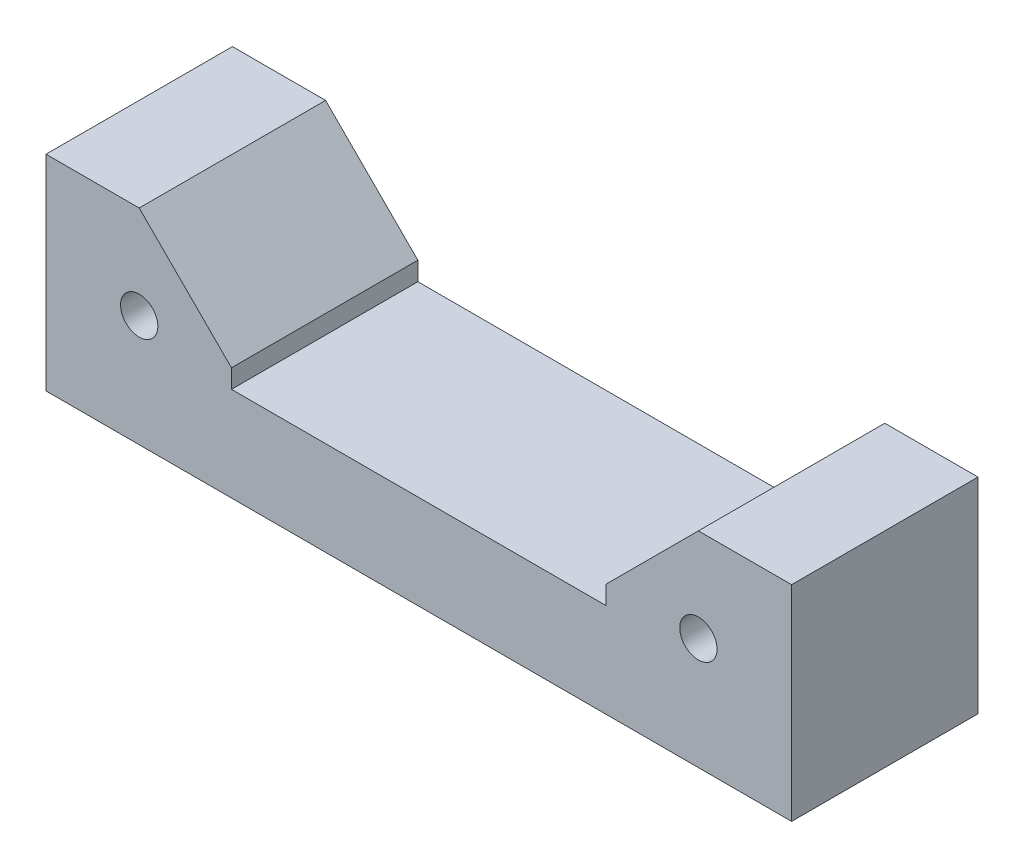
ISO-10303-21;
HEADER;
FILE_DESCRIPTION(('STEP AP214'),'2;1');
FILE_NAME('part.step','',(''),(''),'','','');
FILE_SCHEMA(('AUTOMOTIVE_DESIGN { 1 0 10303 214 1 1 1 1 }'));
ENDSEC;
DATA;
#1=APPLICATION_CONTEXT('core data for automotive mechanical design processes');
#2=APPLICATION_PROTOCOL_DEFINITION('international standard','automotive_design',2000,#1);
#3=PRODUCT_CONTEXT('',#1,'mechanical');
#4=PRODUCT('Part','Part','',(#3));
#5=PRODUCT_RELATED_PRODUCT_CATEGORY('part','',(#4));
#6=PRODUCT_DEFINITION_FORMATION('','',#4);
#7=PRODUCT_DEFINITION_CONTEXT('part definition',#1,'design');
#8=PRODUCT_DEFINITION('design','',#6,#7);
#9=PRODUCT_DEFINITION_SHAPE('','',#8);
#10=(LENGTH_UNIT() NAMED_UNIT(*) SI_UNIT(.MILLI.,.METRE.));
#11=(NAMED_UNIT(*) PLANE_ANGLE_UNIT() SI_UNIT($,.RADIAN.));
#12=(NAMED_UNIT(*) SI_UNIT($,.STERADIAN.) SOLID_ANGLE_UNIT());
#13=UNCERTAINTY_MEASURE_WITH_UNIT(LENGTH_MEASURE(1.E-05),#10,'distance_accuracy_value','');
#14=(GEOMETRIC_REPRESENTATION_CONTEXT(3) GLOBAL_UNCERTAINTY_ASSIGNED_CONTEXT((#13)) GLOBAL_UNIT_ASSIGNED_CONTEXT((#10,
#11,#12)) REPRESENTATION_CONTEXT('',''));
#15=CARTESIAN_POINT('',(0.,0.,0.));
#16=DIRECTION('',(0.,0.,1.));
#17=DIRECTION('',(1.,0.,0.));
#18=AXIS2_PLACEMENT_3D('',#15,#16,#17);
#19=CARTESIAN_POINT('',(0.,0.,5.));
#20=DIRECTION('',(0.,0.,-1.));
#21=DIRECTION('',(-1.,0.,0.));
#22=AXIS2_PLACEMENT_3D('',#19,#20,#21);
#23=PLANE('',#22);
#24=DIRECTION('',(0.,-1.,0.));
#25=VECTOR('',#24,1.);
#26=CARTESIAN_POINT('',(-20.,0.,5.));
#27=LINE('',#26,#25);
#28=CARTESIAN_POINT('',(-20.,11.,5.));
#29=VERTEX_POINT('',#28);
#30=CARTESIAN_POINT('',(-20.,0.,5.));
#31=VERTEX_POINT('',#30);
#32=EDGE_CURVE('E186',#29,#31,#27,.T.);
#33=ORIENTED_EDGE('',*,*,#32,.T.);
#34=DIRECTION('',(1.,0.,0.));
#35=VECTOR('',#34,1.);
#36=CARTESIAN_POINT('',(-20.,0.,5.));
#37=LINE('',#36,#35);
#38=CARTESIAN_POINT('',(20.,0.,5.));
#39=VERTEX_POINT('',#38);
#40=EDGE_CURVE('E110',#31,#39,#37,.T.);
#41=ORIENTED_EDGE('',*,*,#40,.T.);
#42=DIRECTION('',(0.,1.,0.));
#43=VECTOR('',#42,1.);
#44=CARTESIAN_POINT('',(20.,0.,5.));
#45=LINE('',#44,#43);
#46=CARTESIAN_POINT('',(20.,11.,5.));
#47=VERTEX_POINT('',#46);
#48=EDGE_CURVE('E215',#39,#47,#45,.T.);
#49=ORIENTED_EDGE('',*,*,#48,.T.);
#50=DIRECTION('',(-1.,0.,0.));
#51=VECTOR('',#50,1.);
#52=CARTESIAN_POINT('',(20.,11.,5.));
#53=LINE('',#52,#51);
#54=CARTESIAN_POINT('',(15.,11.,5.));
#55=VERTEX_POINT('',#54);
#56=EDGE_CURVE('E235',#47,#55,#53,.T.);
#57=ORIENTED_EDGE('',*,*,#56,.T.);
#58=DIRECTION('',(-0.707106781186549,-0.707106781186546,0.));
#59=VECTOR('',#58,1.);
#60=CARTESIAN_POINT('',(15.,11.,5.));
#61=LINE('',#60,#59);
#62=CARTESIAN_POINT('',(10.0502525316942,6.05025253169418,5.));
#63=VERTEX_POINT('',#62);
#64=EDGE_CURVE('E231',#55,#63,#61,.T.);
#65=ORIENTED_EDGE('',*,*,#64,.T.);
#66=DIRECTION('',(0.,-1.,0.));
#67=VECTOR('',#66,1.);
#68=CARTESIAN_POINT('',(10.0502525316942,6.05025253169418,5.));
#69=LINE('',#68,#67);
#70=CARTESIAN_POINT('',(10.0502525316942,5.05025253169418,5.));
#71=VERTEX_POINT('',#70);
#72=EDGE_CURVE('E234',#63,#71,#69,.T.);
#73=ORIENTED_EDGE('',*,*,#72,.T.);
#74=DIRECTION('',(-1.,0.,0.));
#75=VECTOR('',#74,1.);
#76=CARTESIAN_POINT('',(-10.0502525316942,5.05025253169418,5.));
#77=LINE('',#76,#75);
#78=CARTESIAN_POINT('',(-10.0502525316942,5.05025253169418,5.));
#79=VERTEX_POINT('',#78);
#80=EDGE_CURVE('E135',#71,#79,#77,.T.);
#81=ORIENTED_EDGE('',*,*,#80,.T.);
#82=DIRECTION('',(0.,1.,0.));
#83=VECTOR('',#82,1.);
#84=CARTESIAN_POINT('',(-10.0502525316942,6.05025253169418,5.));
#85=LINE('',#84,#83);
#86=CARTESIAN_POINT('',(-10.0502525316942,6.05025253169418,5.));
#87=VERTEX_POINT('',#86);
#88=EDGE_CURVE('E129',#79,#87,#85,.T.);
#89=ORIENTED_EDGE('',*,*,#88,.T.);
#90=DIRECTION('',(-0.707106781186549,0.707106781186546,0.));
#91=VECTOR('',#90,1.);
#92=CARTESIAN_POINT('',(-15.,11.,5.));
#93=LINE('',#92,#91);
#94=CARTESIAN_POINT('',(-15.,11.,5.));
#95=VERTEX_POINT('',#94);
#96=EDGE_CURVE('E133',#87,#95,#93,.T.);
#97=ORIENTED_EDGE('',*,*,#96,.T.);
#98=DIRECTION('',(-1.,0.,0.));
#99=VECTOR('',#98,1.);
#100=CARTESIAN_POINT('',(-20.,11.,5.));
#101=LINE('',#100,#99);
#102=EDGE_CURVE('E61',#95,#29,#101,.T.);
#103=ORIENTED_EDGE('',*,*,#102,.T.);
#104=EDGE_LOOP('',(#33,#41,#49,#57,#65,#73,#81,#89,#97,#103));
#105=FACE_BOUND('',#104,.T.);
#106=CARTESIAN_POINT('',(-15.,6.,5.));
#107=DIRECTION('',(0.,0.,1.));
#108=DIRECTION('',(1.,0.,0.));
#109=AXIS2_PLACEMENT_3D('',#106,#107,#108);
#110=CIRCLE('',#109,1.);
#111=CARTESIAN_POINT('',(-14.,6.,5.));
#112=VERTEX_POINT('',#111);
#113=EDGE_CURVE('E162',#112,#112,#110,.T.);
#114=ORIENTED_EDGE('',*,*,#113,.F.);
#115=EDGE_LOOP('',(#114));
#116=FACE_BOUND('',#115,.T.);
#117=CARTESIAN_POINT('',(15.,6.,5.));
#118=DIRECTION('',(0.,0.,1.));
#119=DIRECTION('',(-1.,0.,0.));
#120=AXIS2_PLACEMENT_3D('',#117,#118,#119);
#121=CIRCLE('',#120,1.);
#122=CARTESIAN_POINT('',(14.,6.,5.));
#123=VERTEX_POINT('',#122);
#124=EDGE_CURVE('E253',#123,#123,#121,.T.);
#125=ORIENTED_EDGE('',*,*,#124,.F.);
#126=EDGE_LOOP('',(#125));
#127=FACE_BOUND('',#126,.T.);
#128=ADVANCED_FACE('F43',(#105,#116,#127),#23,.F.);
#129=CARTESIAN_POINT('',(0.,0.,-5.));
#130=DIRECTION('',(0.,0.,-1.));
#131=DIRECTION('',(-1.,0.,0.));
#132=AXIS2_PLACEMENT_3D('',#129,#130,#131);
#133=PLANE('',#132);
#134=CARTESIAN_POINT('',(-15.,6.,-5.));
#135=DIRECTION('',(0.,0.,1.));
#136=DIRECTION('',(1.,0.,0.));
#137=AXIS2_PLACEMENT_3D('',#134,#135,#136);
#138=CIRCLE('',#137,1.);
#139=CARTESIAN_POINT('',(-14.,6.,-5.));
#140=VERTEX_POINT('',#139);
#141=EDGE_CURVE('E249',#140,#140,#138,.T.);
#142=ORIENTED_EDGE('',*,*,#141,.T.);
#143=EDGE_LOOP('',(#142));
#144=FACE_BOUND('',#143,.T.);
#145=DIRECTION('',(0.,-1.,0.));
#146=VECTOR('',#145,1.);
#147=CARTESIAN_POINT('',(-20.,0.,-5.));
#148=LINE('',#147,#146);
#149=CARTESIAN_POINT('',(-20.,11.,-5.));
#150=VERTEX_POINT('',#149);
#151=CARTESIAN_POINT('',(-20.,0.,-5.));
#152=VERTEX_POINT('',#151);
#153=EDGE_CURVE('E157',#150,#152,#148,.T.);
#154=ORIENTED_EDGE('',*,*,#153,.F.);
#155=DIRECTION('',(-1.,0.,0.));
#156=VECTOR('',#155,1.);
#157=CARTESIAN_POINT('',(-20.,11.,-5.));
#158=LINE('',#157,#156);
#159=CARTESIAN_POINT('',(-15.,11.,-5.));
#160=VERTEX_POINT('',#159);
#161=EDGE_CURVE('E102',#160,#150,#158,.T.);
#162=ORIENTED_EDGE('',*,*,#161,.F.);
#163=DIRECTION('',(-0.707106781186549,0.707106781186546,0.));
#164=VECTOR('',#163,1.);
#165=CARTESIAN_POINT('',(-15.,11.,-5.));
#166=LINE('',#165,#164);
#167=CARTESIAN_POINT('',(-10.0502525316942,6.05025253169418,-5.));
#168=VERTEX_POINT('',#167);
#169=EDGE_CURVE('E96',#168,#160,#166,.T.);
#170=ORIENTED_EDGE('',*,*,#169,.F.);
#171=DIRECTION('',(0.,1.,0.));
#172=VECTOR('',#171,1.);
#173=CARTESIAN_POINT('',(-10.0502525316942,6.05025253169418,-5.));
#174=LINE('',#173,#172);
#175=CARTESIAN_POINT('',(-10.0502525316942,5.05025253169418,-5.));
#176=VERTEX_POINT('',#175);
#177=EDGE_CURVE('E144',#176,#168,#174,.T.);
#178=ORIENTED_EDGE('',*,*,#177,.F.);
#179=DIRECTION('',(-1.,0.,0.));
#180=VECTOR('',#179,1.);
#181=CARTESIAN_POINT('',(-10.0502525316942,5.05025253169418,-5.));
#182=LINE('',#181,#180);
#183=CARTESIAN_POINT('',(10.0502525316942,5.05025253169418,-5.));
#184=VERTEX_POINT('',#183);
#185=EDGE_CURVE('E177',#184,#176,#182,.T.);
#186=ORIENTED_EDGE('',*,*,#185,.F.);
#187=DIRECTION('',(0.,-1.,0.));
#188=VECTOR('',#187,1.);
#189=CARTESIAN_POINT('',(10.0502525316942,6.05025253169418,-5.));
#190=LINE('',#189,#188);
#191=CARTESIAN_POINT('',(10.0502525316942,6.05025253169418,-5.));
#192=VERTEX_POINT('',#191);
#193=EDGE_CURVE('E174',#192,#184,#190,.T.);
#194=ORIENTED_EDGE('',*,*,#193,.F.);
#195=DIRECTION('',(-0.707106781186549,-0.707106781186546,0.));
#196=VECTOR('',#195,1.);
#197=CARTESIAN_POINT('',(15.,11.,-5.));
#198=LINE('',#197,#196);
#199=CARTESIAN_POINT('',(15.,11.,-5.));
#200=VERTEX_POINT('',#199);
#201=EDGE_CURVE('E171',#200,#192,#198,.T.);
#202=ORIENTED_EDGE('',*,*,#201,.F.);
#203=DIRECTION('',(-1.,0.,0.));
#204=VECTOR('',#203,1.);
#205=CARTESIAN_POINT('',(20.,11.,-5.));
#206=LINE('',#205,#204);
#207=CARTESIAN_POINT('',(20.,11.,-5.));
#208=VERTEX_POINT('',#207);
#209=EDGE_CURVE('E168',#208,#200,#206,.T.);
#210=ORIENTED_EDGE('',*,*,#209,.F.);
#211=DIRECTION('',(0.,1.,0.));
#212=VECTOR('',#211,1.);
#213=CARTESIAN_POINT('',(20.,0.,-5.));
#214=LINE('',#213,#212);
#215=CARTESIAN_POINT('',(20.,0.,-5.));
#216=VERTEX_POINT('',#215);
#217=EDGE_CURVE('E165',#216,#208,#214,.T.);
#218=ORIENTED_EDGE('',*,*,#217,.F.);
#219=DIRECTION('',(1.,0.,0.));
#220=VECTOR('',#219,1.);
#221=CARTESIAN_POINT('',(-20.,0.,-5.));
#222=LINE('',#221,#220);
#223=EDGE_CURVE('E161',#152,#216,#222,.T.);
#224=ORIENTED_EDGE('',*,*,#223,.F.);
#225=EDGE_LOOP('',(#154,#162,#170,#178,#186,#194,#202,#210,#218,#224));
#226=FACE_BOUND('',#225,.T.);
#227=CARTESIAN_POINT('',(15.,6.,-5.));
#228=DIRECTION('',(0.,0.,1.));
#229=DIRECTION('',(-1.,0.,0.));
#230=AXIS2_PLACEMENT_3D('',#227,#228,#229);
#231=CIRCLE('',#230,1.);
#232=CARTESIAN_POINT('',(14.,6.,-5.));
#233=VERTEX_POINT('',#232);
#234=EDGE_CURVE('E257',#233,#233,#231,.T.);
#235=ORIENTED_EDGE('',*,*,#234,.T.);
#236=EDGE_LOOP('',(#235));
#237=FACE_BOUND('',#236,.T.);
#238=ADVANCED_FACE('F219',(#144,#226,#237),#133,.T.);
#239=CARTESIAN_POINT('',(-20.,0.,5.));
#240=DIRECTION('',(1.,0.,0.));
#241=DIRECTION('',(0.,0.,-1.));
#242=AXIS2_PLACEMENT_3D('',#239,#240,#241);
#243=PLANE('',#242);
#244=ORIENTED_EDGE('',*,*,#153,.T.);
#245=DIRECTION('',(0.,0.,-1.));
#246=VECTOR('',#245,1.);
#247=CARTESIAN_POINT('',(-20.,0.,5.));
#248=LINE('',#247,#246);
#249=EDGE_CURVE('E11',#31,#152,#248,.T.);
#250=ORIENTED_EDGE('',*,*,#249,.F.);
#251=ORIENTED_EDGE('',*,*,#32,.F.);
#252=DIRECTION('',(0.,0.,-1.));
#253=VECTOR('',#252,1.);
#254=CARTESIAN_POINT('',(-20.,11.,5.));
#255=LINE('',#254,#253);
#256=EDGE_CURVE('E153',#29,#150,#255,.T.);
#257=ORIENTED_EDGE('',*,*,#256,.T.);
#258=EDGE_LOOP('',(#244,#250,#251,#257));
#259=FACE_BOUND('',#258,.T.);
#260=ADVANCED_FACE('F45',(#259),#243,.F.);
#261=CARTESIAN_POINT('',(-20.,0.,5.));
#262=DIRECTION('',(0.,1.,0.));
#263=DIRECTION('',(-1.,0.,0.));
#264=AXIS2_PLACEMENT_3D('',#261,#262,#263);
#265=PLANE('',#264);
#266=ORIENTED_EDGE('',*,*,#223,.T.);
#267=DIRECTION('',(0.,0.,-1.));
#268=VECTOR('',#267,1.);
#269=CARTESIAN_POINT('',(20.,0.,5.));
#270=LINE('',#269,#268);
#271=EDGE_CURVE('E53',#39,#216,#270,.T.);
#272=ORIENTED_EDGE('',*,*,#271,.F.);
#273=ORIENTED_EDGE('',*,*,#40,.F.);
#274=ORIENTED_EDGE('',*,*,#249,.T.);
#275=EDGE_LOOP('',(#266,#272,#273,#274));
#276=FACE_BOUND('',#275,.T.);
#277=ADVANCED_FACE('F299',(#276),#265,.F.);
#278=CARTESIAN_POINT('',(20.,0.,5.));
#279=DIRECTION('',(-1.,0.,0.));
#280=DIRECTION('',(0.,0.,1.));
#281=AXIS2_PLACEMENT_3D('',#278,#279,#280);
#282=PLANE('',#281);
#283=ORIENTED_EDGE('',*,*,#217,.T.);
#284=DIRECTION('',(0.,0.,-1.));
#285=VECTOR('',#284,1.);
#286=CARTESIAN_POINT('',(20.,11.,5.));
#287=LINE('',#286,#285);
#288=EDGE_CURVE('E205',#47,#208,#287,.T.);
#289=ORIENTED_EDGE('',*,*,#288,.F.);
#290=ORIENTED_EDGE('',*,*,#48,.F.);
#291=ORIENTED_EDGE('',*,*,#271,.T.);
#292=EDGE_LOOP('',(#283,#289,#290,#291));
#293=FACE_BOUND('',#292,.T.);
#294=ADVANCED_FACE('F213',(#293),#282,.F.);
#295=CARTESIAN_POINT('',(20.,11.,5.));
#296=DIRECTION('',(0.,-1.,0.));
#297=DIRECTION('',(0.,0.,-1.));
#298=AXIS2_PLACEMENT_3D('',#295,#296,#297);
#299=PLANE('',#298);
#300=ORIENTED_EDGE('',*,*,#209,.T.);
#301=DIRECTION('',(0.,0.,-1.));
#302=VECTOR('',#301,1.);
#303=CARTESIAN_POINT('',(15.,11.,5.));
#304=LINE('',#303,#302);
#305=EDGE_CURVE('E201',#55,#200,#304,.T.);
#306=ORIENTED_EDGE('',*,*,#305,.F.);
#307=ORIENTED_EDGE('',*,*,#56,.F.);
#308=ORIENTED_EDGE('',*,*,#288,.T.);
#309=EDGE_LOOP('',(#300,#306,#307,#308));
#310=FACE_BOUND('',#309,.T.);
#311=ADVANCED_FACE('F225',(#310),#299,.F.);
#312=CARTESIAN_POINT('',(15.,11.,5.));
#313=DIRECTION('',(0.707106781186546,-0.707106781186549,0.));
#314=DIRECTION('',(0.707106781186549,0.707106781186546,0.));
#315=AXIS2_PLACEMENT_3D('',#312,#313,#314);
#316=PLANE('',#315);
#317=ORIENTED_EDGE('',*,*,#201,.T.);
#318=DIRECTION('',(0.,0.,-1.));
#319=VECTOR('',#318,1.);
#320=CARTESIAN_POINT('',(10.0502525316942,6.05025253169418,5.));
#321=LINE('',#320,#319);
#322=EDGE_CURVE('E197',#63,#192,#321,.T.);
#323=ORIENTED_EDGE('',*,*,#322,.F.);
#324=ORIENTED_EDGE('',*,*,#64,.F.);
#325=ORIENTED_EDGE('',*,*,#305,.T.);
#326=EDGE_LOOP('',(#317,#323,#324,#325));
#327=FACE_BOUND('',#326,.T.);
#328=ADVANCED_FACE('F229',(#327),#316,.F.);
#329=CARTESIAN_POINT('',(10.0502525316942,6.05025253169418,5.));
#330=DIRECTION('',(1.,0.,0.));
#331=DIRECTION('',(0.,0.,-1.));
#332=AXIS2_PLACEMENT_3D('',#329,#330,#331);
#333=PLANE('',#332);
#334=ORIENTED_EDGE('',*,*,#193,.T.);
#335=DIRECTION('',(0.,0.,-1.));
#336=VECTOR('',#335,1.);
#337=CARTESIAN_POINT('',(10.0502525316942,5.05025253169418,5.));
#338=LINE('',#337,#336);
#339=EDGE_CURVE('E193',#71,#184,#338,.T.);
#340=ORIENTED_EDGE('',*,*,#339,.F.);
#341=ORIENTED_EDGE('',*,*,#72,.F.);
#342=ORIENTED_EDGE('',*,*,#322,.T.);
#343=EDGE_LOOP('',(#334,#340,#341,#342));
#344=FACE_BOUND('',#343,.T.);
#345=ADVANCED_FACE('F289',(#344),#333,.F.);
#346=CARTESIAN_POINT('',(-10.0502525316942,5.05025253169418,5.));
#347=DIRECTION('',(0.,-1.,0.));
#348=DIRECTION('',(1.,0.,0.));
#349=AXIS2_PLACEMENT_3D('',#346,#347,#348);
#350=PLANE('',#349);
#351=ORIENTED_EDGE('',*,*,#185,.T.);
#352=DIRECTION('',(0.,0.,-1.));
#353=VECTOR('',#352,1.);
#354=CARTESIAN_POINT('',(-10.0502525316942,5.05025253169418,5.));
#355=LINE('',#354,#353);
#356=EDGE_CURVE('E146',#79,#176,#355,.T.);
#357=ORIENTED_EDGE('',*,*,#356,.F.);
#358=ORIENTED_EDGE('',*,*,#80,.F.);
#359=ORIENTED_EDGE('',*,*,#339,.T.);
#360=EDGE_LOOP('',(#351,#357,#358,#359));
#361=FACE_BOUND('',#360,.T.);
#362=ADVANCED_FACE('F286',(#361),#350,.F.);
#363=CARTESIAN_POINT('',(-10.0502525316942,6.05025253169418,5.));
#364=DIRECTION('',(-1.,0.,0.));
#365=DIRECTION('',(0.,0.,1.));
#366=AXIS2_PLACEMENT_3D('',#363,#364,#365);
#367=PLANE('',#366);
#368=ORIENTED_EDGE('',*,*,#177,.T.);
#369=DIRECTION('',(0.,0.,-1.));
#370=VECTOR('',#369,1.);
#371=CARTESIAN_POINT('',(-10.0502525316942,6.05025253169418,5.));
#372=LINE('',#371,#370);
#373=EDGE_CURVE('E141',#87,#168,#372,.T.);
#374=ORIENTED_EDGE('',*,*,#373,.F.);
#375=ORIENTED_EDGE('',*,*,#88,.F.);
#376=ORIENTED_EDGE('',*,*,#356,.T.);
#377=EDGE_LOOP('',(#368,#374,#375,#376));
#378=FACE_BOUND('',#377,.T.);
#379=ADVANCED_FACE('F142',(#378),#367,.F.);
#380=CARTESIAN_POINT('',(-15.,11.,5.));
#381=DIRECTION('',(-0.707106781186546,-0.707106781186549,0.));
#382=DIRECTION('',(0.707106781186549,-0.707106781186546,0.));
#383=AXIS2_PLACEMENT_3D('',#380,#381,#382);
#384=PLANE('',#383);
#385=ORIENTED_EDGE('',*,*,#169,.T.);
#386=DIRECTION('',(0.,0.,-1.));
#387=VECTOR('',#386,1.);
#388=CARTESIAN_POINT('',(-15.,11.,5.));
#389=LINE('',#388,#387);
#390=EDGE_CURVE('E147',#95,#160,#389,.T.);
#391=ORIENTED_EDGE('',*,*,#390,.F.);
#392=ORIENTED_EDGE('',*,*,#96,.F.);
#393=ORIENTED_EDGE('',*,*,#373,.T.);
#394=EDGE_LOOP('',(#385,#391,#392,#393));
#395=FACE_BOUND('',#394,.T.);
#396=ADVANCED_FACE('F149',(#395),#384,.F.);
#397=CARTESIAN_POINT('',(-20.,11.,5.));
#398=DIRECTION('',(0.,-1.,0.));
#399=DIRECTION('',(0.,0.,-1.));
#400=AXIS2_PLACEMENT_3D('',#397,#398,#399);
#401=PLANE('',#400);
#402=ORIENTED_EDGE('',*,*,#161,.T.);
#403=ORIENTED_EDGE('',*,*,#256,.F.);
#404=ORIENTED_EDGE('',*,*,#102,.F.);
#405=ORIENTED_EDGE('',*,*,#390,.T.);
#406=EDGE_LOOP('',(#402,#403,#404,#405));
#407=FACE_BOUND('',#406,.T.);
#408=ADVANCED_FACE('F279',(#407),#401,.F.);
#409=CARTESIAN_POINT('',(-15.,6.,5.));
#410=DIRECTION('',(0.,0.,-1.));
#411=DIRECTION('',(-1.,0.,0.));
#412=AXIS2_PLACEMENT_3D('',#409,#410,#411);
#413=CYLINDRICAL_SURFACE('',#412,1.);
#414=ORIENTED_EDGE('',*,*,#113,.T.);
#415=EDGE_LOOP('',(#414));
#416=FACE_BOUND('',#415,.T.);
#417=ORIENTED_EDGE('',*,*,#141,.F.);
#418=EDGE_LOOP('',(#417));
#419=FACE_BOUND('',#418,.T.);
#420=ADVANCED_FACE('F276',(#416,#419),#413,.F.);
#421=CARTESIAN_POINT('',(15.,6.,5.));
#422=DIRECTION('',(0.,0.,-1.));
#423=DIRECTION('',(-1.,0.,0.));
#424=AXIS2_PLACEMENT_3D('',#421,#422,#423);
#425=CYLINDRICAL_SURFACE('',#424,1.);
#426=ORIENTED_EDGE('',*,*,#124,.T.);
#427=EDGE_LOOP('',(#426));
#428=FACE_BOUND('',#427,.T.);
#429=ORIENTED_EDGE('',*,*,#234,.F.);
#430=EDGE_LOOP('',(#429));
#431=FACE_BOUND('',#430,.T.);
#432=ADVANCED_FACE('F265',(#428,#431),#425,.F.);
#433=CLOSED_SHELL('',(#128,#238,#260,#277,#294,#311,#328,#345,#362,#379,#396,#408,#420,#432));
#434=MANIFOLD_SOLID_BREP('B2',#433);
#435=ADVANCED_BREP_SHAPE_REPRESENTATION('',(#18,#434),#14);
#436=SHAPE_DEFINITION_REPRESENTATION(#9,#435);
ENDSEC;
END-ISO-10303-21;
